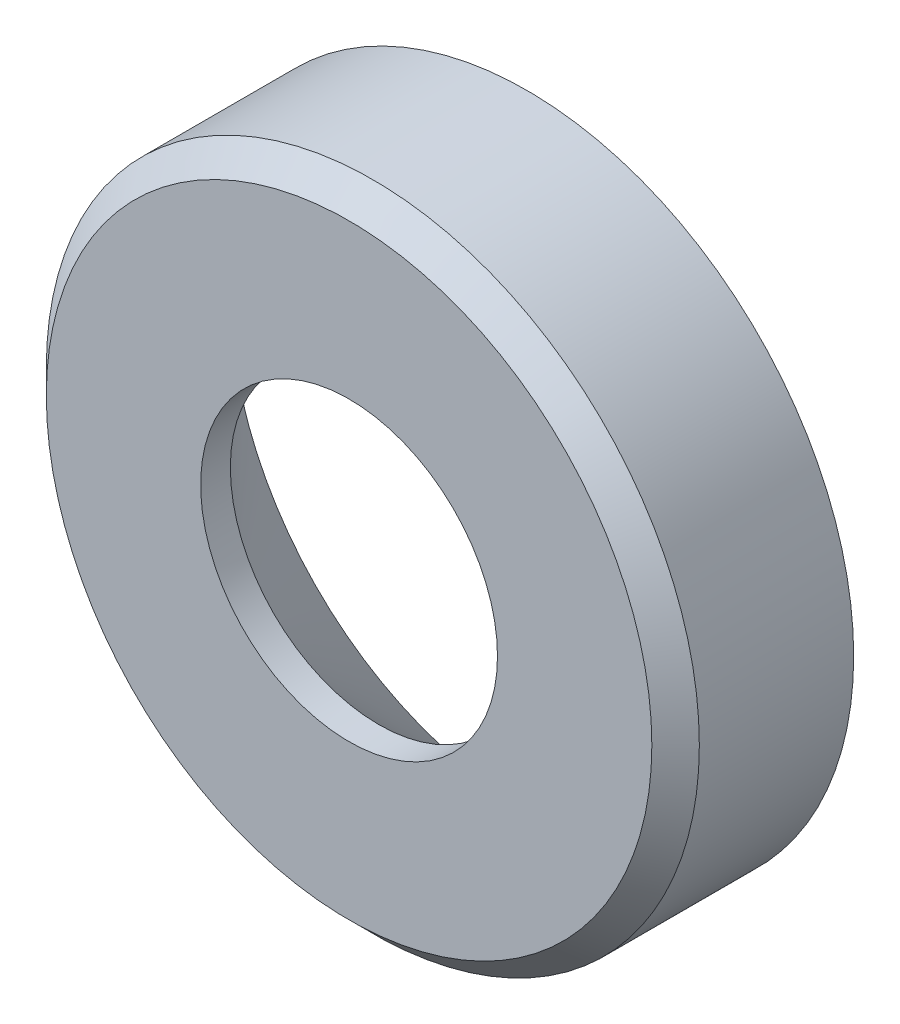
ISO-10303-21;
HEADER;
FILE_DESCRIPTION(('STEP AP214'),'2;1');
FILE_NAME('part.step','',(''),(''),'','','');
FILE_SCHEMA(('AUTOMOTIVE_DESIGN { 1 0 10303 214 1 1 1 1 }'));
ENDSEC;
DATA;
#1=APPLICATION_CONTEXT('core data for automotive mechanical design processes');
#2=APPLICATION_PROTOCOL_DEFINITION('international standard','automotive_design',2000,#1);
#3=PRODUCT_CONTEXT('',#1,'mechanical');
#4=PRODUCT('Part','Part','',(#3));
#5=PRODUCT_RELATED_PRODUCT_CATEGORY('part','',(#4));
#6=PRODUCT_DEFINITION_FORMATION('','',#4);
#7=PRODUCT_DEFINITION_CONTEXT('part definition',#1,'design');
#8=PRODUCT_DEFINITION('design','',#6,#7);
#9=PRODUCT_DEFINITION_SHAPE('','',#8);
#10=(LENGTH_UNIT() NAMED_UNIT(*) SI_UNIT(.MILLI.,.METRE.));
#11=(NAMED_UNIT(*) PLANE_ANGLE_UNIT() SI_UNIT($,.RADIAN.));
#12=(NAMED_UNIT(*) SI_UNIT($,.STERADIAN.) SOLID_ANGLE_UNIT());
#13=UNCERTAINTY_MEASURE_WITH_UNIT(LENGTH_MEASURE(1.E-05),#10,'distance_accuracy_value','');
#14=(GEOMETRIC_REPRESENTATION_CONTEXT(3) GLOBAL_UNCERTAINTY_ASSIGNED_CONTEXT((#13)) GLOBAL_UNIT_ASSIGNED_CONTEXT((#10,
#11,#12)) REPRESENTATION_CONTEXT('',''));
#15=CARTESIAN_POINT('',(0.,0.,0.));
#16=DIRECTION('',(0.,0.,1.));
#17=DIRECTION('',(1.,0.,0.));
#18=AXIS2_PLACEMENT_3D('',#15,#16,#17);
#19=CARTESIAN_POINT('',(0.,0.,-18.499993883903));
#20=DIRECTION('',(0.,0.,1.));
#21=DIRECTION('',(1.,0.,0.));
#22=AXIS2_PLACEMENT_3D('',#19,#20,#21);
#23=CYLINDRICAL_SURFACE('',#22,1.25);
#24=CARTESIAN_POINT('',(0.,0.,-17.2499938839223));
#25=DIRECTION('',(0.,0.,-1.));
#26=DIRECTION('',(1.,0.,0.));
#27=AXIS2_PLACEMENT_3D('',#24,#25,#26);
#28=CIRCLE('',#27,1.25000000002728);
#29=CARTESIAN_POINT('',(1.25000000002728,0.,-17.2499938839223));
#30=VERTEX_POINT('',#29);
#31=EDGE_CURVE('E31',#30,#30,#28,.T.);
#32=ORIENTED_EDGE('',*,*,#31,.T.);
#33=EDGE_LOOP('',(#32));
#34=FACE_BOUND('',#33,.T.);
#35=CARTESIAN_POINT('',(0.,0.,-16.999993883903));
#36=DIRECTION('',(0.,0.,1.));
#37=DIRECTION('',(1.,0.,0.));
#38=AXIS2_PLACEMENT_3D('',#35,#36,#37);
#39=CIRCLE('',#38,1.25);
#40=CARTESIAN_POINT('',(1.25,0.,-16.999993883903));
#41=VERTEX_POINT('',#40);
#42=EDGE_CURVE('E18',#41,#41,#39,.T.);
#43=ORIENTED_EDGE('',*,*,#42,.T.);
#44=EDGE_LOOP('',(#43));
#45=FACE_BOUND('',#44,.T.);
#46=ADVANCED_FACE('F15',(#34,#45),#23,.F.);
#47=CARTESIAN_POINT('',(0.,0.,-16.999993883903));
#48=DIRECTION('',(0.,0.,-1.));
#49=DIRECTION('',(-1.,0.,0.));
#50=AXIS2_PLACEMENT_3D('',#47,#48,#49);
#51=PLANE('',#50);
#52=ORIENTED_EDGE('',*,*,#42,.F.);
#53=EDGE_LOOP('',(#52));
#54=FACE_BOUND('',#53,.T.);
#55=CARTESIAN_POINT('',(0.,0.,-16.9999938838714));
#56=DIRECTION('',(0.,0.,-1.));
#57=DIRECTION('',(-1.,0.,0.));
#58=AXIS2_PLACEMENT_3D('',#55,#56,#57);
#59=CIRCLE('',#58,2.54999999998518);
#60=CARTESIAN_POINT('',(-2.54999999998518,0.,-16.9999938838714));
#61=VERTEX_POINT('',#60);
#62=EDGE_CURVE('E33',#61,#61,#59,.T.);
#63=ORIENTED_EDGE('',*,*,#62,.F.);
#64=EDGE_LOOP('',(#63));
#65=FACE_BOUND('',#64,.T.);
#66=ADVANCED_FACE('F44',(#54,#65),#51,.F.);
#67=CARTESIAN_POINT('',(0.,0.,-18.4999938838928));
#68=DIRECTION('',(0.,0.,-1.));
#69=DIRECTION('',(-1.,0.,0.));
#70=AXIS2_PLACEMENT_3D('',#67,#68,#69);
#71=CONICAL_SURFACE('',#70,2.49999999994088,0.785398163397448);
#72=ORIENTED_EDGE('',*,*,#31,.F.);
#73=EDGE_LOOP('',(#72));
#74=FACE_BOUND('',#73,.T.);
#75=CARTESIAN_POINT('',(0.,0.,-18.4999938839496));
#76=DIRECTION('',(0.,0.,-1.));
#77=DIRECTION('',(-1.,0.,0.));
#78=AXIS2_PLACEMENT_3D('',#75,#76,#77);
#79=CIRCLE('',#78,2.49999999999773);
#80=CARTESIAN_POINT('',(-2.49999999999773,0.,-18.4999938839496));
#81=VERTEX_POINT('',#80);
#82=EDGE_CURVE('E27',#81,#81,#79,.F.);
#83=ORIENTED_EDGE('',*,*,#82,.F.);
#84=EDGE_LOOP('',(#83));
#85=FACE_BOUND('',#84,.T.);
#86=ADVANCED_FACE('F47',(#74,#85),#71,.F.);
#87=CARTESIAN_POINT('',(0.,0.,-17.1999938839349));
#88=DIRECTION('',(0.,0.,-1.));
#89=DIRECTION('',(-1.,0.,0.));
#90=AXIS2_PLACEMENT_3D('',#87,#88,#89);
#91=CONICAL_SURFACE('',#90,2.74999999999181,0.78539816325534);
#92=CARTESIAN_POINT('',(0.,0.,-17.199993883903));
#93=DIRECTION('',(0.,0.,1.));
#94=DIRECTION('',(1.,0.,0.));
#95=AXIS2_PLACEMENT_3D('',#92,#93,#94);
#96=CIRCLE('',#95,2.75);
#97=CARTESIAN_POINT('',(2.75,0.,-17.199993883903));
#98=VERTEX_POINT('',#97);
#99=EDGE_CURVE('E22',#98,#98,#96,.F.);
#100=ORIENTED_EDGE('',*,*,#99,.F.);
#101=EDGE_LOOP('',(#100));
#102=FACE_BOUND('',#101,.T.);
#103=ORIENTED_EDGE('',*,*,#62,.T.);
#104=EDGE_LOOP('',(#103));
#105=FACE_BOUND('',#104,.T.);
#106=ADVANCED_FACE('F53',(#102,#105),#91,.T.);
#107=CARTESIAN_POINT('',(0.,0.,-18.499993883903));
#108=DIRECTION('',(0.,0.,-1.));
#109=DIRECTION('',(-1.,0.,0.));
#110=AXIS2_PLACEMENT_3D('',#107,#108,#109);
#111=PLANE('',#110);
#112=ORIENTED_EDGE('',*,*,#82,.T.);
#113=EDGE_LOOP('',(#112));
#114=FACE_BOUND('',#113,.T.);
#115=CARTESIAN_POINT('',(0.,0.,-18.499993883903));
#116=DIRECTION('',(0.,0.,1.));
#117=DIRECTION('',(1.,0.,0.));
#118=AXIS2_PLACEMENT_3D('',#115,#116,#117);
#119=CIRCLE('',#118,2.75);
#120=CARTESIAN_POINT('',(2.75,0.,-18.499993883903));
#121=VERTEX_POINT('',#120);
#122=EDGE_CURVE('E10',#121,#121,#119,.T.);
#123=ORIENTED_EDGE('',*,*,#122,.F.);
#124=EDGE_LOOP('',(#123));
#125=FACE_BOUND('',#124,.T.);
#126=ADVANCED_FACE('F58',(#114,#125),#111,.T.);
#127=CARTESIAN_POINT('',(0.,0.,-18.499993883903));
#128=DIRECTION('',(0.,0.,1.));
#129=DIRECTION('',(1.,0.,0.));
#130=AXIS2_PLACEMENT_3D('',#127,#128,#129);
#131=CYLINDRICAL_SURFACE('',#130,2.75);
#132=ORIENTED_EDGE('',*,*,#122,.T.);
#133=EDGE_LOOP('',(#132));
#134=FACE_BOUND('',#133,.T.);
#135=ORIENTED_EDGE('',*,*,#99,.T.);
#136=EDGE_LOOP('',(#135));
#137=FACE_BOUND('',#136,.T.);
#138=ADVANCED_FACE('F56',(#134,#137),#131,.T.);
#139=CLOSED_SHELL('',(#46,#66,#86,#106,#126,#138));
#140=MANIFOLD_SOLID_BREP('B1',#139);
#141=ADVANCED_BREP_SHAPE_REPRESENTATION('',(#18,#140),#14);
#142=SHAPE_DEFINITION_REPRESENTATION(#9,#141);
ENDSEC;
END-ISO-10303-21;
